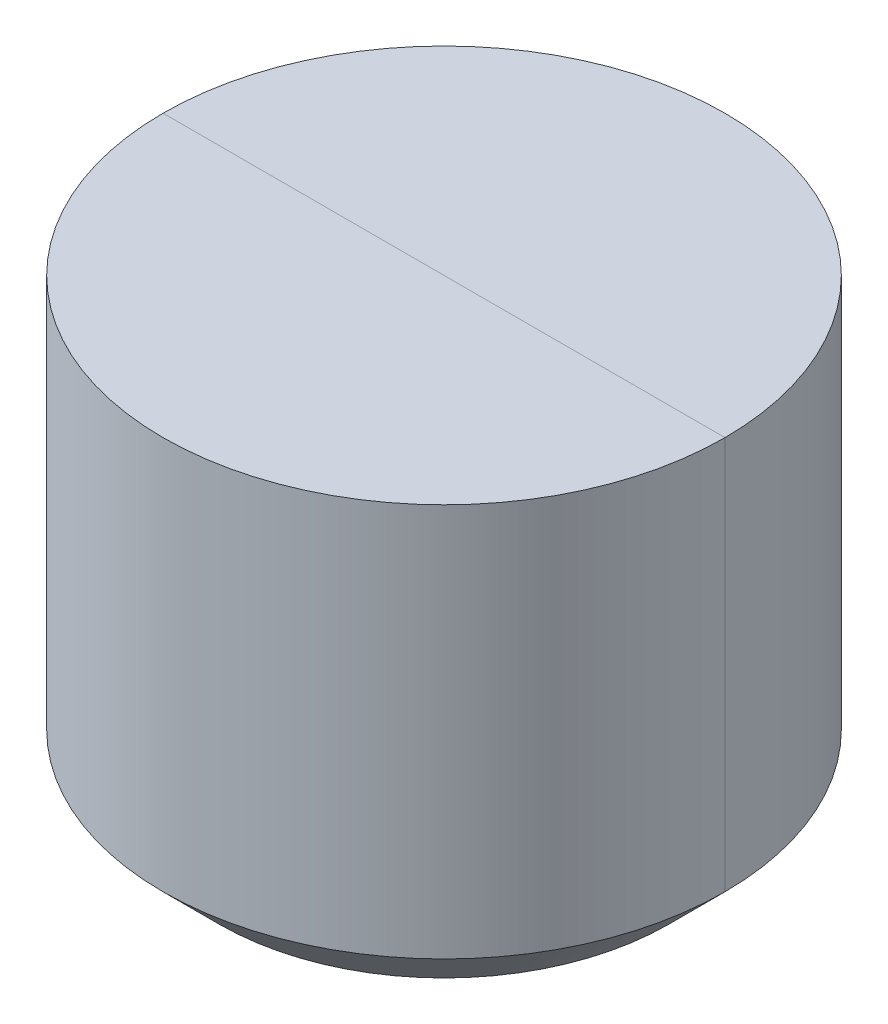
ISO-10303-21;
HEADER;
FILE_DESCRIPTION(('STEP AP214'),'2;1');
FILE_NAME('part.step','',(''),(''),'','','');
FILE_SCHEMA(('AUTOMOTIVE_DESIGN { 1 0 10303 214 1 1 1 1 }'));
ENDSEC;
DATA;
#1=APPLICATION_CONTEXT('core data for automotive mechanical design processes');
#2=APPLICATION_PROTOCOL_DEFINITION('international standard','automotive_design',2000,#1);
#3=PRODUCT_CONTEXT('',#1,'mechanical');
#4=PRODUCT('Part','Part','',(#3));
#5=PRODUCT_RELATED_PRODUCT_CATEGORY('part','',(#4));
#6=PRODUCT_DEFINITION_FORMATION('','',#4);
#7=PRODUCT_DEFINITION_CONTEXT('part definition',#1,'design');
#8=PRODUCT_DEFINITION('design','',#6,#7);
#9=PRODUCT_DEFINITION_SHAPE('','',#8);
#10=(LENGTH_UNIT() NAMED_UNIT(*) SI_UNIT(.MILLI.,.METRE.));
#11=(NAMED_UNIT(*) PLANE_ANGLE_UNIT() SI_UNIT($,.RADIAN.));
#12=(NAMED_UNIT(*) SI_UNIT($,.STERADIAN.) SOLID_ANGLE_UNIT());
#13=UNCERTAINTY_MEASURE_WITH_UNIT(LENGTH_MEASURE(1.E-05),#10,'distance_accuracy_value','');
#14=(GEOMETRIC_REPRESENTATION_CONTEXT(3) GLOBAL_UNCERTAINTY_ASSIGNED_CONTEXT((#13)) GLOBAL_UNIT_ASSIGNED_CONTEXT((#10,
#11,#12)) REPRESENTATION_CONTEXT('',''));
#15=CARTESIAN_POINT('',(0.,0.,0.));
#16=DIRECTION('',(0.,0.,1.));
#17=DIRECTION('',(1.,0.,0.));
#18=AXIS2_PLACEMENT_3D('',#15,#16,#17);
#19=CARTESIAN_POINT('',(0.,-1.5,0.));
#20=DIRECTION('',(0.,1.,0.));
#21=DIRECTION('',(0.,0.,1.));
#22=AXIS2_PLACEMENT_3D('',#19,#20,#21);
#23=CONICAL_SURFACE('',#22,2.5,0.78539816339745);
#24=DIRECTION('',(0.,0.707106781186546,0.707106781186549));
#25=VECTOR('',#24,1.);
#26=CARTESIAN_POINT('',(0.,-1.5,2.5));
#27=LINE('',#26,#25);
#28=CARTESIAN_POINT('',(0.,-2.,2.));
#29=VERTEX_POINT('',#28);
#30=CARTESIAN_POINT('',(0.,-1.5,2.5));
#31=VERTEX_POINT('',#30);
#32=EDGE_CURVE('E128',#29,#31,#27,.T.);
#33=ORIENTED_EDGE('',*,*,#32,.F.);
#34=CARTESIAN_POINT('',(0.,-2.,0.));
#35=DIRECTION('',(0.,-1.,0.));
#36=DIRECTION('',(0.,0.,1.));
#37=AXIS2_PLACEMENT_3D('',#34,#35,#36);
#38=CIRCLE('',#37,2.);
#39=CARTESIAN_POINT('',(2.,-2.,0.));
#40=VERTEX_POINT('',#39);
#41=EDGE_CURVE('E134',#40,#29,#38,.T.);
#42=ORIENTED_EDGE('',*,*,#41,.F.);
#43=DIRECTION('',(0.707106781186549,0.707106781186546,0.));
#44=VECTOR('',#43,1.);
#45=CARTESIAN_POINT('',(2.,-2.,0.));
#46=LINE('',#45,#44);
#47=CARTESIAN_POINT('',(2.5,-1.5,0.));
#48=VERTEX_POINT('',#47);
#49=EDGE_CURVE('E11',#40,#48,#46,.T.);
#50=ORIENTED_EDGE('',*,*,#49,.T.);
#51=CARTESIAN_POINT('',(0.,-1.5,0.));
#52=DIRECTION('',(0.,1.,0.));
#53=DIRECTION('',(0.,0.,1.));
#54=AXIS2_PLACEMENT_3D('',#51,#52,#53);
#55=CIRCLE('',#54,2.5);
#56=EDGE_CURVE('E97',#31,#48,#55,.T.);
#57=ORIENTED_EDGE('',*,*,#56,.F.);
#58=EDGE_LOOP('',(#33,#42,#50,#57));
#59=FACE_BOUND('',#58,.T.);
#60=ADVANCED_FACE('F17',(#59),#23,.T.);
#61=CARTESIAN_POINT('',(0.,-1.5,0.));
#62=DIRECTION('',(0.,1.,0.));
#63=DIRECTION('',(0.,0.,1.));
#64=AXIS2_PLACEMENT_3D('',#61,#62,#63);
#65=CONICAL_SURFACE('',#64,2.5,0.78539816339745);
#66=ORIENTED_EDGE('',*,*,#49,.F.);
#67=CARTESIAN_POINT('',(0.,-2.,0.));
#68=DIRECTION('',(0.,-1.,0.));
#69=DIRECTION('',(0.,0.,1.));
#70=AXIS2_PLACEMENT_3D('',#67,#68,#69);
#71=CIRCLE('',#70,2.);
#72=CARTESIAN_POINT('',(-2.,-2.,0.));
#73=VERTEX_POINT('',#72);
#74=EDGE_CURVE('E28',#73,#40,#71,.T.);
#75=ORIENTED_EDGE('',*,*,#74,.F.);
#76=DIRECTION('',(0.707106781186549,-0.707106781186546,0.));
#77=VECTOR('',#76,1.);
#78=CARTESIAN_POINT('',(-2.5,-1.5,0.));
#79=LINE('',#78,#77);
#80=CARTESIAN_POINT('',(-2.5,-1.5,0.));
#81=VERTEX_POINT('',#80);
#82=EDGE_CURVE('E113',#81,#73,#79,.T.);
#83=ORIENTED_EDGE('',*,*,#82,.F.);
#84=CARTESIAN_POINT('',(0.,-1.5,0.));
#85=DIRECTION('',(0.,1.,0.));
#86=DIRECTION('',(0.,0.,1.));
#87=AXIS2_PLACEMENT_3D('',#84,#85,#86);
#88=CIRCLE('',#87,2.5);
#89=CARTESIAN_POINT('',(0.,-1.5,-2.5));
#90=VERTEX_POINT('',#89);
#91=EDGE_CURVE('E106',#90,#81,#88,.T.);
#92=ORIENTED_EDGE('',*,*,#91,.F.);
#93=CARTESIAN_POINT('',(0.,-1.5,0.));
#94=DIRECTION('',(0.,1.,0.));
#95=DIRECTION('',(0.,0.,1.));
#96=AXIS2_PLACEMENT_3D('',#93,#94,#95);
#97=CIRCLE('',#96,2.5);
#98=EDGE_CURVE('E136',#48,#90,#97,.T.);
#99=ORIENTED_EDGE('',*,*,#98,.F.);
#100=EDGE_LOOP('',(#66,#75,#83,#92,#99));
#101=FACE_BOUND('',#100,.T.);
#102=ADVANCED_FACE('F155',(#101),#65,.T.);
#103=CARTESIAN_POINT('',(0.,-2.,0.));
#104=DIRECTION('',(0.,1.,0.));
#105=DIRECTION('',(1.,0.,0.));
#106=AXIS2_PLACEMENT_3D('',#103,#104,#105);
#107=PLANE('',#106);
#108=DIRECTION('',(1.,0.,0.));
#109=VECTOR('',#108,1.);
#110=CARTESIAN_POINT('',(0.,-2.,0.));
#111=LINE('',#110,#109);
#112=EDGE_CURVE('E89',#73,#40,#111,.T.);
#113=ORIENTED_EDGE('',*,*,#112,.F.);
#114=ORIENTED_EDGE('',*,*,#74,.T.);
#115=EDGE_LOOP('',(#113,#114));
#116=FACE_BOUND('',#115,.T.);
#117=ADVANCED_FACE('F167',(#116),#107,.F.);
#118=CARTESIAN_POINT('',(0.,2.,0.));
#119=DIRECTION('',(0.,1.,0.));
#120=DIRECTION('',(1.,0.,0.));
#121=AXIS2_PLACEMENT_3D('',#118,#119,#120);
#122=PLANE('',#121);
#123=DIRECTION('',(1.,0.,0.));
#124=VECTOR('',#123,1.);
#125=CARTESIAN_POINT('',(0.,2.,0.));
#126=LINE('',#125,#124);
#127=CARTESIAN_POINT('',(-2.5,2.,0.));
#128=VERTEX_POINT('',#127);
#129=CARTESIAN_POINT('',(2.5,2.,0.));
#130=VERTEX_POINT('',#129);
#131=EDGE_CURVE('E91',#128,#130,#126,.T.);
#132=ORIENTED_EDGE('',*,*,#131,.F.);
#133=CARTESIAN_POINT('',(0.,2.,0.));
#134=DIRECTION('',(0.,1.,0.));
#135=DIRECTION('',(0.,0.,1.));
#136=AXIS2_PLACEMENT_3D('',#133,#134,#135);
#137=CIRCLE('',#136,2.5);
#138=EDGE_CURVE('E76',#128,#130,#137,.T.);
#139=ORIENTED_EDGE('',*,*,#138,.T.);
#140=EDGE_LOOP('',(#132,#139));
#141=FACE_BOUND('',#140,.T.);
#142=ADVANCED_FACE('F92',(#141),#122,.T.);
#143=CARTESIAN_POINT('',(0.,2.,0.));
#144=DIRECTION('',(0.,-1.,0.));
#145=DIRECTION('',(0.,0.,-1.));
#146=AXIS2_PLACEMENT_3D('',#143,#144,#145);
#147=CYLINDRICAL_SURFACE('',#146,2.5);
#148=DIRECTION('',(0.,-1.,0.));
#149=VECTOR('',#148,1.);
#150=CARTESIAN_POINT('',(0.,2.,-2.5));
#151=LINE('',#150,#149);
#152=CARTESIAN_POINT('',(0.,2.,-2.5));
#153=VERTEX_POINT('',#152);
#154=EDGE_CURVE('E112',#153,#90,#151,.T.);
#155=ORIENTED_EDGE('',*,*,#154,.F.);
#156=CARTESIAN_POINT('',(0.,2.,0.));
#157=DIRECTION('',(0.,1.,0.));
#158=DIRECTION('',(0.,0.,1.));
#159=AXIS2_PLACEMENT_3D('',#156,#157,#158);
#160=CIRCLE('',#159,2.5);
#161=EDGE_CURVE('E98',#130,#153,#160,.T.);
#162=ORIENTED_EDGE('',*,*,#161,.F.);
#163=DIRECTION('',(0.,1.,0.));
#164=VECTOR('',#163,1.);
#165=CARTESIAN_POINT('',(2.5,2.,0.));
#166=LINE('',#165,#164);
#167=EDGE_CURVE('E85',#48,#130,#166,.T.);
#168=ORIENTED_EDGE('',*,*,#167,.F.);
#169=ORIENTED_EDGE('',*,*,#98,.T.);
#170=EDGE_LOOP('',(#155,#162,#168,#169));
#171=FACE_BOUND('',#170,.T.);
#172=ADVANCED_FACE('F157',(#171),#147,.T.);
#173=CARTESIAN_POINT('',(0.,-2.,0.));
#174=DIRECTION('',(0.,1.,0.));
#175=DIRECTION('',(1.,0.,0.));
#176=AXIS2_PLACEMENT_3D('',#173,#174,#175);
#177=PLANE('',#176);
#178=ORIENTED_EDGE('',*,*,#112,.T.);
#179=ORIENTED_EDGE('',*,*,#41,.T.);
#180=CARTESIAN_POINT('',(0.,-2.,0.));
#181=DIRECTION('',(0.,-1.,0.));
#182=DIRECTION('',(0.,0.,1.));
#183=AXIS2_PLACEMENT_3D('',#180,#181,#182);
#184=CIRCLE('',#183,2.);
#185=EDGE_CURVE('E21',#29,#73,#184,.T.);
#186=ORIENTED_EDGE('',*,*,#185,.T.);
#187=EDGE_LOOP('',(#178,#179,#186));
#188=FACE_BOUND('',#187,.T.);
#189=ADVANCED_FACE('F159',(#188),#177,.F.);
#190=CARTESIAN_POINT('',(0.,2.,0.));
#191=DIRECTION('',(0.,-1.,0.));
#192=DIRECTION('',(0.,0.,-1.));
#193=AXIS2_PLACEMENT_3D('',#190,#191,#192);
#194=CYLINDRICAL_SURFACE('',#193,2.5);
#195=DIRECTION('',(0.,-1.,0.));
#196=VECTOR('',#195,1.);
#197=CARTESIAN_POINT('',(-2.5,2.,0.));
#198=LINE('',#197,#196);
#199=EDGE_CURVE('E81',#128,#81,#198,.T.);
#200=ORIENTED_EDGE('',*,*,#199,.T.);
#201=CARTESIAN_POINT('',(0.,-1.5,0.));
#202=DIRECTION('',(0.,1.,0.));
#203=DIRECTION('',(0.,0.,1.));
#204=AXIS2_PLACEMENT_3D('',#201,#202,#203);
#205=CIRCLE('',#204,2.5);
#206=EDGE_CURVE('E121',#81,#31,#205,.T.);
#207=ORIENTED_EDGE('',*,*,#206,.T.);
#208=ORIENTED_EDGE('',*,*,#56,.T.);
#209=ORIENTED_EDGE('',*,*,#167,.T.);
#210=ORIENTED_EDGE('',*,*,#138,.F.);
#211=EDGE_LOOP('',(#200,#207,#208,#209,#210));
#212=FACE_BOUND('',#211,.T.);
#213=ADVANCED_FACE('F78',(#212),#194,.T.);
#214=CARTESIAN_POINT('',(0.,2.,0.));
#215=DIRECTION('',(0.,1.,0.));
#216=DIRECTION('',(1.,0.,0.));
#217=AXIS2_PLACEMENT_3D('',#214,#215,#216);
#218=PLANE('',#217);
#219=ORIENTED_EDGE('',*,*,#161,.T.);
#220=CARTESIAN_POINT('',(0.,2.,0.));
#221=DIRECTION('',(0.,1.,0.));
#222=DIRECTION('',(0.,0.,1.));
#223=AXIS2_PLACEMENT_3D('',#220,#221,#222);
#224=CIRCLE('',#223,2.5);
#225=EDGE_CURVE('E104',#153,#128,#224,.T.);
#226=ORIENTED_EDGE('',*,*,#225,.T.);
#227=ORIENTED_EDGE('',*,*,#131,.T.);
#228=EDGE_LOOP('',(#219,#226,#227));
#229=FACE_BOUND('',#228,.T.);
#230=ADVANCED_FACE('F19',(#229),#218,.T.);
#231=CARTESIAN_POINT('',(0.,2.,0.));
#232=DIRECTION('',(0.,-1.,0.));
#233=DIRECTION('',(0.,0.,-1.));
#234=AXIS2_PLACEMENT_3D('',#231,#232,#233);
#235=CYLINDRICAL_SURFACE('',#234,2.5);
#236=ORIENTED_EDGE('',*,*,#225,.F.);
#237=ORIENTED_EDGE('',*,*,#154,.T.);
#238=ORIENTED_EDGE('',*,*,#91,.T.);
#239=ORIENTED_EDGE('',*,*,#199,.F.);
#240=EDGE_LOOP('',(#236,#237,#238,#239));
#241=FACE_BOUND('',#240,.T.);
#242=ADVANCED_FACE('F102',(#241),#235,.T.);
#243=CARTESIAN_POINT('',(0.,-1.5,0.));
#244=DIRECTION('',(0.,1.,0.));
#245=DIRECTION('',(0.,0.,1.));
#246=AXIS2_PLACEMENT_3D('',#243,#244,#245);
#247=CONICAL_SURFACE('',#246,2.5,0.78539816339745);
#248=ORIENTED_EDGE('',*,*,#185,.F.);
#249=ORIENTED_EDGE('',*,*,#32,.T.);
#250=ORIENTED_EDGE('',*,*,#206,.F.);
#251=ORIENTED_EDGE('',*,*,#82,.T.);
#252=EDGE_LOOP('',(#248,#249,#250,#251));
#253=FACE_BOUND('',#252,.T.);
#254=ADVANCED_FACE('F178',(#253),#247,.T.);
#255=CLOSED_SHELL('',(#60,#102,#117,#142,#172,#189,#213,#230,#242,#254));
#256=MANIFOLD_SOLID_BREP('B1',#255);
#257=ADVANCED_BREP_SHAPE_REPRESENTATION('',(#18,#256),#14);
#258=SHAPE_DEFINITION_REPRESENTATION(#9,#257);
ENDSEC;
END-ISO-10303-21;
